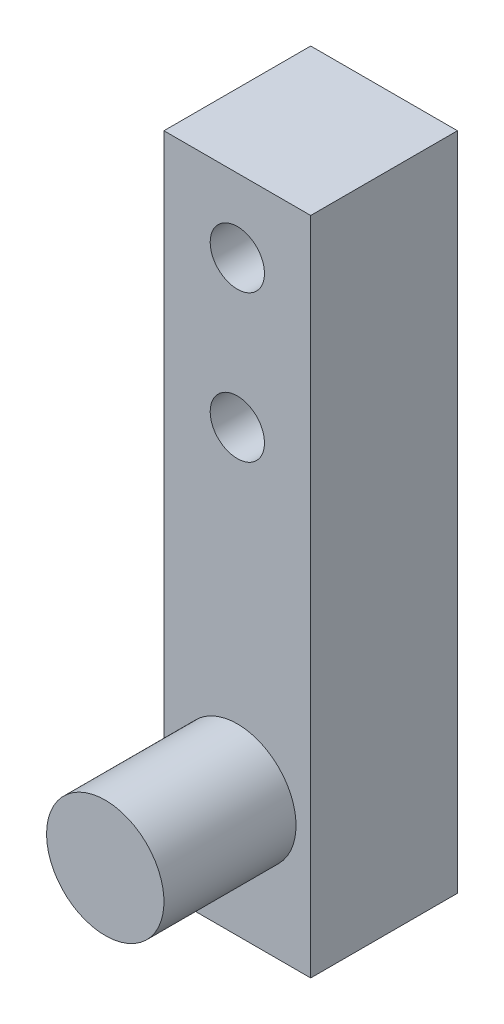
ISO-10303-21;
HEADER;
FILE_DESCRIPTION(('STEP AP214'),'2;1');
FILE_NAME('part.step','',(''),(''),'','','');
FILE_SCHEMA(('AUTOMOTIVE_DESIGN { 1 0 10303 214 1 1 1 1 }'));
ENDSEC;
DATA;
#1=APPLICATION_CONTEXT('core data for automotive mechanical design processes');
#2=APPLICATION_PROTOCOL_DEFINITION('international standard','automotive_design',2000,#1);
#3=PRODUCT_CONTEXT('',#1,'mechanical');
#4=PRODUCT('Part','Part','',(#3));
#5=PRODUCT_RELATED_PRODUCT_CATEGORY('part','',(#4));
#6=PRODUCT_DEFINITION_FORMATION('','',#4);
#7=PRODUCT_DEFINITION_CONTEXT('part definition',#1,'design');
#8=PRODUCT_DEFINITION('design','',#6,#7);
#9=PRODUCT_DEFINITION_SHAPE('','',#8);
#10=(LENGTH_UNIT() NAMED_UNIT(*) SI_UNIT(.MILLI.,.METRE.));
#11=(NAMED_UNIT(*) PLANE_ANGLE_UNIT() SI_UNIT($,.RADIAN.));
#12=(NAMED_UNIT(*) SI_UNIT($,.STERADIAN.) SOLID_ANGLE_UNIT());
#13=UNCERTAINTY_MEASURE_WITH_UNIT(LENGTH_MEASURE(1.E-05),#10,'distance_accuracy_value','');
#14=(GEOMETRIC_REPRESENTATION_CONTEXT(3) GLOBAL_UNCERTAINTY_ASSIGNED_CONTEXT((#13)) GLOBAL_UNIT_ASSIGNED_CONTEXT((#10,
#11,#12)) REPRESENTATION_CONTEXT('',''));
#15=CARTESIAN_POINT('',(0.,0.,0.));
#16=DIRECTION('',(0.,0.,1.));
#17=DIRECTION('',(1.,0.,0.));
#18=AXIS2_PLACEMENT_3D('',#15,#16,#17);
#19=CARTESIAN_POINT('',(-5.,20.,5.));
#20=DIRECTION('',(-1.,0.,0.));
#21=DIRECTION('',(0.,0.,1.));
#22=AXIS2_PLACEMENT_3D('',#19,#20,#21);
#23=PLANE('',#22);
#24=DIRECTION('',(0.,-1.,0.));
#25=VECTOR('',#24,1.);
#26=CARTESIAN_POINT('',(-5.,20.,-5.));
#27=LINE('',#26,#25);
#28=CARTESIAN_POINT('',(-5.,20.,-5.));
#29=VERTEX_POINT('',#28);
#30=CARTESIAN_POINT('',(-5.,-25.,-5.));
#31=VERTEX_POINT('',#30);
#32=EDGE_CURVE('E38',#29,#31,#27,.T.);
#33=ORIENTED_EDGE('',*,*,#32,.T.);
#34=DIRECTION('',(0.,0.,-1.));
#35=VECTOR('',#34,1.);
#36=CARTESIAN_POINT('',(-5.,-25.,5.));
#37=LINE('',#36,#35);
#38=CARTESIAN_POINT('',(-5.,-25.,5.));
#39=VERTEX_POINT('',#38);
#40=EDGE_CURVE('E79',#39,#31,#37,.T.);
#41=ORIENTED_EDGE('',*,*,#40,.F.);
#42=DIRECTION('',(0.,-1.,0.));
#43=VECTOR('',#42,1.);
#44=CARTESIAN_POINT('',(-5.,20.,5.));
#45=LINE('',#44,#43);
#46=CARTESIAN_POINT('',(-5.,20.,5.));
#47=VERTEX_POINT('',#46);
#48=EDGE_CURVE('E11',#47,#39,#45,.T.);
#49=ORIENTED_EDGE('',*,*,#48,.F.);
#50=DIRECTION('',(0.,0.,-1.));
#51=VECTOR('',#50,1.);
#52=CARTESIAN_POINT('',(-5.,20.,5.));
#53=LINE('',#52,#51);
#54=EDGE_CURVE('E110',#47,#29,#53,.T.);
#55=ORIENTED_EDGE('',*,*,#54,.T.);
#56=EDGE_LOOP('',(#33,#41,#49,#55));
#57=FACE_BOUND('',#56,.T.);
#58=ADVANCED_FACE('F35',(#57),#23,.T.);
#59=CARTESIAN_POINT('',(-5.,20.,5.));
#60=DIRECTION('',(0.,0.,-1.));
#61=DIRECTION('',(-1.,0.,0.));
#62=AXIS2_PLACEMENT_3D('',#59,#60,#61);
#63=PLANE('',#62);
#64=CARTESIAN_POINT('',(0.,-16.5,5.));
#65=DIRECTION('',(0.,0.,-1.));
#66=DIRECTION('',(-1.,0.,0.));
#67=AXIS2_PLACEMENT_3D('',#64,#65,#66);
#68=CIRCLE('',#67,4.);
#69=CARTESIAN_POINT('',(-4.,-16.5,5.));
#70=VERTEX_POINT('',#69);
#71=EDGE_CURVE('E92',#70,#70,#68,.T.);
#72=ORIENTED_EDGE('',*,*,#71,.T.);
#73=EDGE_LOOP('',(#72));
#74=FACE_BOUND('',#73,.T.);
#75=CARTESIAN_POINT('',(0.,15.,5.));
#76=DIRECTION('',(0.,0.,-1.));
#77=DIRECTION('',(-1.,0.,0.));
#78=AXIS2_PLACEMENT_3D('',#75,#76,#77);
#79=CIRCLE('',#78,1.85);
#80=CARTESIAN_POINT('',(-1.85,15.,5.));
#81=VERTEX_POINT('',#80);
#82=EDGE_CURVE('E101',#81,#81,#79,.T.);
#83=ORIENTED_EDGE('',*,*,#82,.T.);
#84=EDGE_LOOP('',(#83));
#85=FACE_BOUND('',#84,.T.);
#86=CARTESIAN_POINT('',(0.,5.,5.));
#87=DIRECTION('',(0.,0.,-1.));
#88=DIRECTION('',(-1.,0.,0.));
#89=AXIS2_PLACEMENT_3D('',#86,#87,#88);
#90=CIRCLE('',#89,1.85);
#91=CARTESIAN_POINT('',(-1.85,5.,5.));
#92=VERTEX_POINT('',#91);
#93=EDGE_CURVE('E107',#92,#92,#90,.T.);
#94=ORIENTED_EDGE('',*,*,#93,.T.);
#95=EDGE_LOOP('',(#94));
#96=FACE_BOUND('',#95,.T.);
#97=ORIENTED_EDGE('',*,*,#48,.T.);
#98=DIRECTION('',(-1.,0.,0.));
#99=VECTOR('',#98,1.);
#100=CARTESIAN_POINT('',(5.,-25.,5.));
#101=LINE('',#100,#99);
#102=CARTESIAN_POINT('',(5.,-25.,5.));
#103=VERTEX_POINT('',#102);
#104=EDGE_CURVE('E77',#103,#39,#101,.T.);
#105=ORIENTED_EDGE('',*,*,#104,.F.);
#106=DIRECTION('',(0.,-1.,0.));
#107=VECTOR('',#106,1.);
#108=CARTESIAN_POINT('',(5.,20.,5.));
#109=LINE('',#108,#107);
#110=CARTESIAN_POINT('',(5.,20.,5.));
#111=VERTEX_POINT('',#110);
#112=EDGE_CURVE('E43',#111,#103,#109,.T.);
#113=ORIENTED_EDGE('',*,*,#112,.F.);
#114=DIRECTION('',(1.,0.,0.));
#115=VECTOR('',#114,1.);
#116=CARTESIAN_POINT('',(-5.,20.,5.));
#117=LINE('',#116,#115);
#118=EDGE_CURVE('E56',#47,#111,#117,.T.);
#119=ORIENTED_EDGE('',*,*,#118,.F.);
#120=EDGE_LOOP('',(#97,#105,#113,#119));
#121=FACE_BOUND('',#120,.T.);
#122=ADVANCED_FACE('F75',(#74,#85,#96,#121),#63,.F.);
#123=CARTESIAN_POINT('',(5.,20.,5.));
#124=DIRECTION('',(-1.,0.,0.));
#125=DIRECTION('',(0.,0.,1.));
#126=AXIS2_PLACEMENT_3D('',#123,#124,#125);
#127=PLANE('',#126);
#128=ORIENTED_EDGE('',*,*,#112,.T.);
#129=DIRECTION('',(0.,0.,1.));
#130=VECTOR('',#129,1.);
#131=CARTESIAN_POINT('',(5.,-25.,-5.));
#132=LINE('',#131,#130);
#133=CARTESIAN_POINT('',(5.,-25.,-5.));
#134=VERTEX_POINT('',#133);
#135=EDGE_CURVE('E88',#134,#103,#132,.T.);
#136=ORIENTED_EDGE('',*,*,#135,.F.);
#137=DIRECTION('',(0.,-1.,0.));
#138=VECTOR('',#137,1.);
#139=CARTESIAN_POINT('',(5.,20.,-5.));
#140=LINE('',#139,#138);
#141=CARTESIAN_POINT('',(5.,20.,-5.));
#142=VERTEX_POINT('',#141);
#143=EDGE_CURVE('E118',#142,#134,#140,.T.);
#144=ORIENTED_EDGE('',*,*,#143,.F.);
#145=DIRECTION('',(0.,0.,-1.));
#146=VECTOR('',#145,1.);
#147=CARTESIAN_POINT('',(5.,20.,5.));
#148=LINE('',#147,#146);
#149=EDGE_CURVE('E115',#111,#142,#148,.T.);
#150=ORIENTED_EDGE('',*,*,#149,.F.);
#151=EDGE_LOOP('',(#128,#136,#144,#150));
#152=FACE_BOUND('',#151,.T.);
#153=ADVANCED_FACE('F125',(#152),#127,.F.);
#154=CARTESIAN_POINT('',(-5.,20.,-5.));
#155=DIRECTION('',(0.,0.,-1.));
#156=DIRECTION('',(-1.,0.,0.));
#157=AXIS2_PLACEMENT_3D('',#154,#155,#156);
#158=PLANE('',#157);
#159=CARTESIAN_POINT('',(0.,15.,-5.));
#160=DIRECTION('',(0.,0.,-1.));
#161=DIRECTION('',(-1.,0.,0.));
#162=AXIS2_PLACEMENT_3D('',#159,#160,#161);
#163=CIRCLE('',#162,1.84999999999999);
#164=CARTESIAN_POINT('',(-1.84999999999999,15.,-5.));
#165=VERTEX_POINT('',#164);
#166=EDGE_CURVE('E98',#165,#165,#163,.T.);
#167=ORIENTED_EDGE('',*,*,#166,.F.);
#168=EDGE_LOOP('',(#167));
#169=FACE_BOUND('',#168,.T.);
#170=CARTESIAN_POINT('',(0.,5.,-5.));
#171=DIRECTION('',(0.,0.,-1.));
#172=DIRECTION('',(-1.,0.,0.));
#173=AXIS2_PLACEMENT_3D('',#170,#171,#172);
#174=CIRCLE('',#173,1.84999999999999);
#175=CARTESIAN_POINT('',(-1.84999999999999,5.,-5.));
#176=VERTEX_POINT('',#175);
#177=EDGE_CURVE('E104',#176,#176,#174,.T.);
#178=ORIENTED_EDGE('',*,*,#177,.F.);
#179=EDGE_LOOP('',(#178));
#180=FACE_BOUND('',#179,.T.);
#181=ORIENTED_EDGE('',*,*,#143,.T.);
#182=DIRECTION('',(1.,0.,0.));
#183=VECTOR('',#182,1.);
#184=CARTESIAN_POINT('',(-5.,-25.,-5.));
#185=LINE('',#184,#183);
#186=EDGE_CURVE('E83',#31,#134,#185,.T.);
#187=ORIENTED_EDGE('',*,*,#186,.F.);
#188=ORIENTED_EDGE('',*,*,#32,.F.);
#189=DIRECTION('',(1.,0.,0.));
#190=VECTOR('',#189,1.);
#191=CARTESIAN_POINT('',(-5.,20.,-5.));
#192=LINE('',#191,#190);
#193=EDGE_CURVE('E112',#29,#142,#192,.T.);
#194=ORIENTED_EDGE('',*,*,#193,.T.);
#195=EDGE_LOOP('',(#181,#187,#188,#194));
#196=FACE_BOUND('',#195,.T.);
#197=ADVANCED_FACE('F121',(#169,#180,#196),#158,.T.);
#198=CARTESIAN_POINT('',(0.,20.,0.));
#199=DIRECTION('',(0.,-1.,0.));
#200=DIRECTION('',(0.,0.,-1.));
#201=AXIS2_PLACEMENT_3D('',#198,#199,#200);
#202=PLANE('',#201);
#203=ORIENTED_EDGE('',*,*,#54,.F.);
#204=ORIENTED_EDGE('',*,*,#118,.T.);
#205=ORIENTED_EDGE('',*,*,#149,.T.);
#206=ORIENTED_EDGE('',*,*,#193,.F.);
#207=EDGE_LOOP('',(#203,#204,#205,#206));
#208=FACE_BOUND('',#207,.T.);
#209=ADVANCED_FACE('F126',(#208),#202,.F.);
#210=CARTESIAN_POINT('',(0.,5.,-5.));
#211=DIRECTION('',(0.,0.,-1.));
#212=DIRECTION('',(-1.,0.,0.));
#213=AXIS2_PLACEMENT_3D('',#210,#211,#212);
#214=CYLINDRICAL_SURFACE('',#213,1.84999999999999);
#215=ORIENTED_EDGE('',*,*,#93,.F.);
#216=EDGE_LOOP('',(#215));
#217=FACE_BOUND('',#216,.T.);
#218=ORIENTED_EDGE('',*,*,#177,.T.);
#219=EDGE_LOOP('',(#218));
#220=FACE_BOUND('',#219,.T.);
#221=ADVANCED_FACE('F128',(#217,#220),#214,.F.);
#222=CARTESIAN_POINT('',(0.,15.,-5.));
#223=DIRECTION('',(0.,0.,-1.));
#224=DIRECTION('',(-1.,0.,0.));
#225=AXIS2_PLACEMENT_3D('',#222,#223,#224);
#226=CYLINDRICAL_SURFACE('',#225,1.84999999999999);
#227=ORIENTED_EDGE('',*,*,#82,.F.);
#228=EDGE_LOOP('',(#227));
#229=FACE_BOUND('',#228,.T.);
#230=ORIENTED_EDGE('',*,*,#166,.T.);
#231=EDGE_LOOP('',(#230));
#232=FACE_BOUND('',#231,.T.);
#233=ADVANCED_FACE('F134',(#229,#232),#226,.F.);
#234=CARTESIAN_POINT('',(0.,-25.,0.));
#235=DIRECTION('',(0.,-1.,0.));
#236=DIRECTION('',(0.,0.,-1.));
#237=AXIS2_PLACEMENT_3D('',#234,#235,#236);
#238=PLANE('',#237);
#239=ORIENTED_EDGE('',*,*,#104,.T.);
#240=ORIENTED_EDGE('',*,*,#40,.T.);
#241=ORIENTED_EDGE('',*,*,#186,.T.);
#242=ORIENTED_EDGE('',*,*,#135,.T.);
#243=EDGE_LOOP('',(#239,#240,#241,#242));
#244=FACE_BOUND('',#243,.T.);
#245=ADVANCED_FACE('F86',(#244),#238,.T.);
#246=CARTESIAN_POINT('',(0.,-16.5,14.));
#247=DIRECTION('',(0.,0.,-1.));
#248=DIRECTION('',(-1.,0.,0.));
#249=AXIS2_PLACEMENT_3D('',#246,#247,#248);
#250=CYLINDRICAL_SURFACE('',#249,4.);
#251=CARTESIAN_POINT('',(0.,-16.5,14.));
#252=DIRECTION('',(0.,0.,-1.));
#253=DIRECTION('',(-1.,0.,0.));
#254=AXIS2_PLACEMENT_3D('',#251,#252,#253);
#255=CIRCLE('',#254,4.);
#256=CARTESIAN_POINT('',(-4.,-16.5,14.));
#257=VERTEX_POINT('',#256);
#258=EDGE_CURVE('E89',#257,#257,#255,.T.);
#259=ORIENTED_EDGE('',*,*,#258,.T.);
#260=EDGE_LOOP('',(#259));
#261=FACE_BOUND('',#260,.T.);
#262=ORIENTED_EDGE('',*,*,#71,.F.);
#263=EDGE_LOOP('',(#262));
#264=FACE_BOUND('',#263,.T.);
#265=ADVANCED_FACE('F165',(#261,#264),#250,.T.);
#266=CARTESIAN_POINT('',(0.,-16.5,14.));
#267=DIRECTION('',(0.,0.,-1.));
#268=DIRECTION('',(-1.,0.,0.));
#269=AXIS2_PLACEMENT_3D('',#266,#267,#268);
#270=PLANE('',#269);
#271=ORIENTED_EDGE('',*,*,#258,.F.);
#272=EDGE_LOOP('',(#271));
#273=FACE_BOUND('',#272,.T.);
#274=ADVANCED_FACE('F170',(#273),#270,.F.);
#275=CLOSED_SHELL('',(#58,#122,#153,#197,#209,#221,#233,#245,#265,#274));
#276=MANIFOLD_SOLID_BREP('B2',#275);
#277=ADVANCED_BREP_SHAPE_REPRESENTATION('',(#18,#276),#14);
#278=SHAPE_DEFINITION_REPRESENTATION(#9,#277);
ENDSEC;
END-ISO-10303-21;
